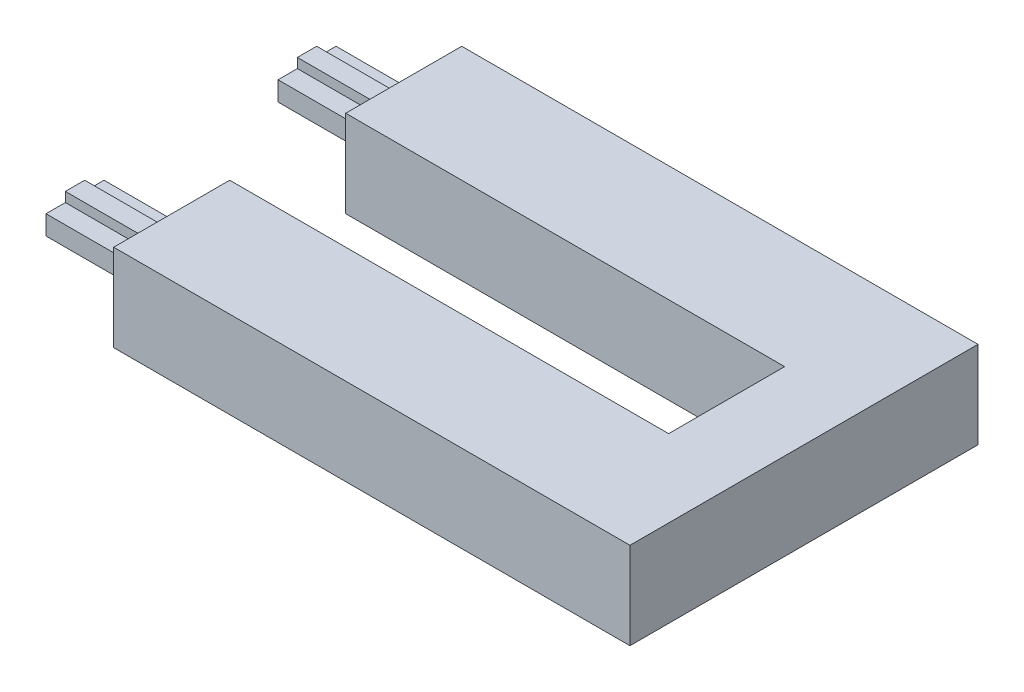
ISO-10303-21;
HEADER;
FILE_DESCRIPTION(('STEP AP214'),'2;1');
FILE_NAME('part.step','',(''),(''),'','','');
FILE_SCHEMA(('AUTOMOTIVE_DESIGN { 1 0 10303 214 1 1 1 1 }'));
ENDSEC;
DATA;
#1=APPLICATION_CONTEXT('core data for automotive mechanical design processes');
#2=APPLICATION_PROTOCOL_DEFINITION('international standard','automotive_design',2000,#1);
#3=PRODUCT_CONTEXT('',#1,'mechanical');
#4=PRODUCT('Part','Part','',(#3));
#5=PRODUCT_RELATED_PRODUCT_CATEGORY('part','',(#4));
#6=PRODUCT_DEFINITION_FORMATION('','',#4);
#7=PRODUCT_DEFINITION_CONTEXT('part definition',#1,'design');
#8=PRODUCT_DEFINITION('design','',#6,#7);
#9=PRODUCT_DEFINITION_SHAPE('','',#8);
#10=(LENGTH_UNIT() NAMED_UNIT(*) SI_UNIT(.MILLI.,.METRE.));
#11=(NAMED_UNIT(*) PLANE_ANGLE_UNIT() SI_UNIT($,.RADIAN.));
#12=(NAMED_UNIT(*) SI_UNIT($,.STERADIAN.) SOLID_ANGLE_UNIT());
#13=UNCERTAINTY_MEASURE_WITH_UNIT(LENGTH_MEASURE(1.E-05),#10,'distance_accuracy_value','');
#14=(GEOMETRIC_REPRESENTATION_CONTEXT(3) GLOBAL_UNCERTAINTY_ASSIGNED_CONTEXT((#13)) GLOBAL_UNIT_ASSIGNED_CONTEXT((#10,
#11,#12)) REPRESENTATION_CONTEXT('',''));
#15=CARTESIAN_POINT('',(0.,0.,0.));
#16=DIRECTION('',(0.,0.,1.));
#17=DIRECTION('',(1.,0.,0.));
#18=AXIS2_PLACEMENT_3D('',#15,#16,#17);
#19=CARTESIAN_POINT('',(0.,4.5,0.));
#20=DIRECTION('',(1.,0.,0.));
#21=DIRECTION('',(0.,0.,-1.));
#22=AXIS2_PLACEMENT_3D('',#19,#20,#21);
#23=PLANE('',#22);
#24=DIRECTION('',(0.,0.,1.));
#25=VECTOR('',#24,1.);
#26=CARTESIAN_POINT('',(0.,1.75,-1.5));
#27=LINE('',#26,#25);
#28=CARTESIAN_POINT('',(0.,1.75,-3.5));
#29=VERTEX_POINT('',#28);
#30=CARTESIAN_POINT('',(0.,1.75,-4.5));
#31=VERTEX_POINT('',#30);
#32=EDGE_CURVE('E354',#29,#31,#27,.F.);
#33=ORIENTED_EDGE('',*,*,#32,.T.);
#34=DIRECTION('',(0.,1.,0.));
#35=VECTOR('',#34,1.);
#36=CARTESIAN_POINT('',(0.,1.75,-4.5));
#37=LINE('',#36,#35);
#38=CARTESIAN_POINT('',(0.,2.75,-4.5));
#39=VERTEX_POINT('',#38);
#40=EDGE_CURVE('E351',#31,#39,#37,.T.);
#41=ORIENTED_EDGE('',*,*,#40,.T.);
#42=DIRECTION('',(0.,0.,1.));
#43=VECTOR('',#42,1.);
#44=CARTESIAN_POINT('',(0.,2.75,-1.5));
#45=LINE('',#44,#43);
#46=CARTESIAN_POINT('',(0.,2.75,-3.5));
#47=VERTEX_POINT('',#46);
#48=EDGE_CURVE('E321',#47,#39,#45,.F.);
#49=ORIENTED_EDGE('',*,*,#48,.F.);
#50=DIRECTION('',(0.,1.,0.));
#51=VECTOR('',#50,1.);
#52=CARTESIAN_POINT('',(0.,1.25,-3.5));
#53=LINE('',#52,#51);
#54=CARTESIAN_POINT('',(0.,3.25,-3.5));
#55=VERTEX_POINT('',#54);
#56=EDGE_CURVE('E404',#47,#55,#53,.T.);
#57=ORIENTED_EDGE('',*,*,#56,.T.);
#58=DIRECTION('',(0.,0.,1.));
#59=VECTOR('',#58,1.);
#60=CARTESIAN_POINT('',(0.,3.25,-3.5));
#61=LINE('',#60,#59);
#62=CARTESIAN_POINT('',(0.,3.25,-2.5));
#63=VERTEX_POINT('',#62);
#64=EDGE_CURVE('E400',#55,#63,#61,.T.);
#65=ORIENTED_EDGE('',*,*,#64,.T.);
#66=DIRECTION('',(0.,1.,0.));
#67=VECTOR('',#66,1.);
#68=CARTESIAN_POINT('',(0.,1.25,-2.5));
#69=LINE('',#68,#67);
#70=CARTESIAN_POINT('',(0.,2.75,-2.5));
#71=VERTEX_POINT('',#70);
#72=EDGE_CURVE('E379',#71,#63,#69,.T.);
#73=ORIENTED_EDGE('',*,*,#72,.F.);
#74=CARTESIAN_POINT('',(0.,2.75,-1.5));
#75=VERTEX_POINT('',#74);
#76=EDGE_CURVE('E347',#75,#71,#45,.F.);
#77=ORIENTED_EDGE('',*,*,#76,.F.);
#78=DIRECTION('',(0.,-1.,0.));
#79=VECTOR('',#78,1.);
#80=CARTESIAN_POINT('',(0.,2.75,-1.5));
#81=LINE('',#80,#79);
#82=CARTESIAN_POINT('',(0.,1.75,-1.5));
#83=VERTEX_POINT('',#82);
#84=EDGE_CURVE('E315',#75,#83,#81,.T.);
#85=ORIENTED_EDGE('',*,*,#84,.T.);
#86=CARTESIAN_POINT('',(0.,1.75,-2.5));
#87=VERTEX_POINT('',#86);
#88=EDGE_CURVE('E106',#83,#87,#27,.F.);
#89=ORIENTED_EDGE('',*,*,#88,.T.);
#90=CARTESIAN_POINT('',(0.,1.25,-2.5));
#91=VERTEX_POINT('',#90);
#92=EDGE_CURVE('E397',#91,#87,#69,.T.);
#93=ORIENTED_EDGE('',*,*,#92,.F.);
#94=DIRECTION('',(0.,0.,-1.));
#95=VECTOR('',#94,1.);
#96=CARTESIAN_POINT('',(0.,1.25,-2.5));
#97=LINE('',#96,#95);
#98=CARTESIAN_POINT('',(0.,1.25,-3.5));
#99=VERTEX_POINT('',#98);
#100=EDGE_CURVE('E409',#91,#99,#97,.T.);
#101=ORIENTED_EDGE('',*,*,#100,.T.);
#102=EDGE_CURVE('E405',#99,#29,#53,.T.);
#103=ORIENTED_EDGE('',*,*,#102,.T.);
#104=EDGE_LOOP('',(#33,#41,#49,#57,#65,#73,#77,#85,#89,#93,#101,#103));
#105=FACE_BOUND('',#104,.T.);
#106=DIRECTION('',(0.,0.,1.));
#107=VECTOR('',#106,1.);
#108=CARTESIAN_POINT('',(0.,0.,0.));
#109=LINE('',#108,#107);
#110=CARTESIAN_POINT('',(0.,0.,-6.));
#111=VERTEX_POINT('',#110);
#112=CARTESIAN_POINT('',(0.,0.,0.));
#113=VERTEX_POINT('',#112);
#114=EDGE_CURVE('E534',#111,#113,#109,.T.);
#115=ORIENTED_EDGE('',*,*,#114,.T.);
#116=DIRECTION('',(0.,-1.,0.));
#117=VECTOR('',#116,1.);
#118=CARTESIAN_POINT('',(0.,4.5,0.));
#119=LINE('',#118,#117);
#120=CARTESIAN_POINT('',(0.,4.5,0.));
#121=VERTEX_POINT('',#120);
#122=EDGE_CURVE('E12',#121,#113,#119,.T.);
#123=ORIENTED_EDGE('',*,*,#122,.F.);
#124=DIRECTION('',(0.,0.,1.));
#125=VECTOR('',#124,1.);
#126=CARTESIAN_POINT('',(0.,4.5,0.));
#127=LINE('',#126,#125);
#128=CARTESIAN_POINT('',(0.,4.5,-6.));
#129=VERTEX_POINT('',#128);
#130=EDGE_CURVE('E535',#129,#121,#127,.T.);
#131=ORIENTED_EDGE('',*,*,#130,.F.);
#132=DIRECTION('',(0.,-1.,0.));
#133=VECTOR('',#132,1.);
#134=CARTESIAN_POINT('',(0.,4.5,-6.));
#135=LINE('',#134,#133);
#136=EDGE_CURVE('E561',#129,#111,#135,.T.);
#137=ORIENTED_EDGE('',*,*,#136,.T.);
#138=EDGE_LOOP('',(#115,#123,#131,#137));
#139=FACE_BOUND('',#138,.T.);
#140=ADVANCED_FACE('F91',(#105,#139),#23,.F.);
#141=CARTESIAN_POINT('',(0.,4.5,0.));
#142=DIRECTION('',(0.,0.,-1.));
#143=DIRECTION('',(-1.,0.,0.));
#144=AXIS2_PLACEMENT_3D('',#141,#142,#143);
#145=PLANE('',#144);
#146=DIRECTION('',(1.,0.,0.));
#147=VECTOR('',#146,1.);
#148=CARTESIAN_POINT('',(0.,0.,0.));
#149=LINE('',#148,#147);
#150=CARTESIAN_POINT('',(26.7,0.,0.));
#151=VERTEX_POINT('',#150);
#152=EDGE_CURVE('E565',#113,#151,#149,.T.);
#153=ORIENTED_EDGE('',*,*,#152,.T.);
#154=DIRECTION('',(0.,-1.,0.));
#155=VECTOR('',#154,1.);
#156=CARTESIAN_POINT('',(26.7,4.5,0.));
#157=LINE('',#156,#155);
#158=CARTESIAN_POINT('',(26.7,4.5,0.));
#159=VERTEX_POINT('',#158);
#160=EDGE_CURVE('E99',#159,#151,#157,.T.);
#161=ORIENTED_EDGE('',*,*,#160,.F.);
#162=DIRECTION('',(1.,0.,0.));
#163=VECTOR('',#162,1.);
#164=CARTESIAN_POINT('',(0.,4.5,0.));
#165=LINE('',#164,#163);
#166=EDGE_CURVE('E539',#121,#159,#165,.T.);
#167=ORIENTED_EDGE('',*,*,#166,.F.);
#168=ORIENTED_EDGE('',*,*,#122,.T.);
#169=EDGE_LOOP('',(#153,#161,#167,#168));
#170=FACE_BOUND('',#169,.T.);
#171=ADVANCED_FACE('F636',(#170),#145,.F.);
#172=CARTESIAN_POINT('',(26.7,4.5,0.));
#173=DIRECTION('',(-1.,0.,0.));
#174=DIRECTION('',(0.,0.,1.));
#175=AXIS2_PLACEMENT_3D('',#172,#173,#174);
#176=PLANE('',#175);
#177=DIRECTION('',(0.,0.,-1.));
#178=VECTOR('',#177,1.);
#179=CARTESIAN_POINT('',(26.7,0.,0.));
#180=LINE('',#179,#178);
#181=CARTESIAN_POINT('',(26.7,0.,-18.));
#182=VERTEX_POINT('',#181);
#183=EDGE_CURVE('E568',#151,#182,#180,.T.);
#184=ORIENTED_EDGE('',*,*,#183,.T.);
#185=DIRECTION('',(0.,-1.,0.));
#186=VECTOR('',#185,1.);
#187=CARTESIAN_POINT('',(26.7,4.5,-18.));
#188=LINE('',#187,#186);
#189=CARTESIAN_POINT('',(26.7,4.5,-18.));
#190=VERTEX_POINT('',#189);
#191=EDGE_CURVE('E604',#190,#182,#188,.T.);
#192=ORIENTED_EDGE('',*,*,#191,.F.);
#193=DIRECTION('',(0.,0.,-1.));
#194=VECTOR('',#193,1.);
#195=CARTESIAN_POINT('',(26.7,4.5,0.));
#196=LINE('',#195,#194);
#197=EDGE_CURVE('E543',#159,#190,#196,.T.);
#198=ORIENTED_EDGE('',*,*,#197,.F.);
#199=ORIENTED_EDGE('',*,*,#160,.T.);
#200=EDGE_LOOP('',(#184,#192,#198,#199));
#201=FACE_BOUND('',#200,.T.);
#202=ADVANCED_FACE('F613',(#201),#176,.F.);
#203=CARTESIAN_POINT('',(0.,4.5,-18.));
#204=DIRECTION('',(0.,0.,1.));
#205=DIRECTION('',(1.,0.,0.));
#206=AXIS2_PLACEMENT_3D('',#203,#204,#205);
#207=PLANE('',#206);
#208=DIRECTION('',(-1.,0.,0.));
#209=VECTOR('',#208,1.);
#210=CARTESIAN_POINT('',(0.,0.,-18.));
#211=LINE('',#210,#209);
#212=CARTESIAN_POINT('',(0.,0.,-18.));
#213=VERTEX_POINT('',#212);
#214=EDGE_CURVE('E571',#182,#213,#211,.T.);
#215=ORIENTED_EDGE('',*,*,#214,.T.);
#216=DIRECTION('',(0.,-1.,0.));
#217=VECTOR('',#216,1.);
#218=CARTESIAN_POINT('',(0.,4.5,-18.));
#219=LINE('',#218,#217);
#220=CARTESIAN_POINT('',(0.,4.5,-18.));
#221=VERTEX_POINT('',#220);
#222=EDGE_CURVE('E600',#221,#213,#219,.T.);
#223=ORIENTED_EDGE('',*,*,#222,.F.);
#224=DIRECTION('',(-1.,0.,0.));
#225=VECTOR('',#224,1.);
#226=CARTESIAN_POINT('',(0.,4.5,-18.));
#227=LINE('',#226,#225);
#228=EDGE_CURVE('E546',#190,#221,#227,.T.);
#229=ORIENTED_EDGE('',*,*,#228,.F.);
#230=ORIENTED_EDGE('',*,*,#191,.T.);
#231=EDGE_LOOP('',(#215,#223,#229,#230));
#232=FACE_BOUND('',#231,.T.);
#233=ADVANCED_FACE('F624',(#232),#207,.F.);
#234=CARTESIAN_POINT('',(0.,4.5,-12.));
#235=DIRECTION('',(1.,0.,0.));
#236=DIRECTION('',(0.,0.,-1.));
#237=AXIS2_PLACEMENT_3D('',#234,#235,#236);
#238=PLANE('',#237);
#239=DIRECTION('',(0.,1.,0.));
#240=VECTOR('',#239,1.);
#241=CARTESIAN_POINT('',(0.,1.25,-15.5));
#242=LINE('',#241,#240);
#243=CARTESIAN_POINT('',(0.,2.75,-15.5));
#244=VERTEX_POINT('',#243);
#245=CARTESIAN_POINT('',(0.,3.25,-15.5));
#246=VERTEX_POINT('',#245);
#247=EDGE_CURVE('E453',#244,#246,#242,.T.);
#248=ORIENTED_EDGE('',*,*,#247,.T.);
#249=DIRECTION('',(0.,0.,1.));
#250=VECTOR('',#249,1.);
#251=CARTESIAN_POINT('',(0.,3.25,-15.5));
#252=LINE('',#251,#250);
#253=CARTESIAN_POINT('',(0.,3.25,-14.5));
#254=VERTEX_POINT('',#253);
#255=EDGE_CURVE('E449',#246,#254,#252,.T.);
#256=ORIENTED_EDGE('',*,*,#255,.T.);
#257=DIRECTION('',(0.,1.,0.));
#258=VECTOR('',#257,1.);
#259=CARTESIAN_POINT('',(0.,1.25,-14.5));
#260=LINE('',#259,#258);
#261=CARTESIAN_POINT('',(0.,2.75,-14.5));
#262=VERTEX_POINT('',#261);
#263=EDGE_CURVE('E425',#262,#254,#260,.T.);
#264=ORIENTED_EDGE('',*,*,#263,.F.);
#265=DIRECTION('',(0.,0.,1.));
#266=VECTOR('',#265,1.);
#267=CARTESIAN_POINT('',(0.,2.75,-16.5));
#268=LINE('',#267,#266);
#269=CARTESIAN_POINT('',(0.,2.75,-13.5));
#270=VERTEX_POINT('',#269);
#271=EDGE_CURVE('E513',#262,#270,#268,.T.);
#272=ORIENTED_EDGE('',*,*,#271,.T.);
#273=DIRECTION('',(0.,-1.,0.));
#274=VECTOR('',#273,1.);
#275=CARTESIAN_POINT('',(0.,2.75,-13.5));
#276=LINE('',#275,#274);
#277=CARTESIAN_POINT('',(0.,1.75,-13.5));
#278=VERTEX_POINT('',#277);
#279=EDGE_CURVE('E509',#270,#278,#276,.T.);
#280=ORIENTED_EDGE('',*,*,#279,.T.);
#281=DIRECTION('',(0.,0.,1.));
#282=VECTOR('',#281,1.);
#283=CARTESIAN_POINT('',(0.,1.75,-16.5));
#284=LINE('',#283,#282);
#285=CARTESIAN_POINT('',(0.,1.75,-14.5));
#286=VERTEX_POINT('',#285);
#287=EDGE_CURVE('E486',#286,#278,#284,.T.);
#288=ORIENTED_EDGE('',*,*,#287,.F.);
#289=CARTESIAN_POINT('',(0.,1.25,-14.5));
#290=VERTEX_POINT('',#289);
#291=EDGE_CURVE('E445',#290,#286,#260,.T.);
#292=ORIENTED_EDGE('',*,*,#291,.F.);
#293=DIRECTION('',(0.,0.,-1.));
#294=VECTOR('',#293,1.);
#295=CARTESIAN_POINT('',(0.,1.25,-14.5));
#296=LINE('',#295,#294);
#297=CARTESIAN_POINT('',(0.,1.25,-15.5));
#298=VERTEX_POINT('',#297);
#299=EDGE_CURVE('E456',#290,#298,#296,.T.);
#300=ORIENTED_EDGE('',*,*,#299,.T.);
#301=CARTESIAN_POINT('',(0.,1.75,-15.5));
#302=VERTEX_POINT('',#301);
#303=EDGE_CURVE('E114',#298,#302,#242,.T.);
#304=ORIENTED_EDGE('',*,*,#303,.T.);
#305=CARTESIAN_POINT('',(0.,1.75,-16.5));
#306=VERTEX_POINT('',#305);
#307=EDGE_CURVE('E506',#306,#302,#284,.T.);
#308=ORIENTED_EDGE('',*,*,#307,.F.);
#309=DIRECTION('',(0.,1.,0.));
#310=VECTOR('',#309,1.);
#311=CARTESIAN_POINT('',(0.,1.75,-16.5));
#312=LINE('',#311,#310);
#313=CARTESIAN_POINT('',(0.,2.75,-16.5));
#314=VERTEX_POINT('',#313);
#315=EDGE_CURVE('E518',#306,#314,#312,.T.);
#316=ORIENTED_EDGE('',*,*,#315,.T.);
#317=EDGE_CURVE('E514',#314,#244,#268,.T.);
#318=ORIENTED_EDGE('',*,*,#317,.T.);
#319=EDGE_LOOP('',(#248,#256,#264,#272,#280,#288,#292,#300,#304,#308,#316,#318));
#320=FACE_BOUND('',#319,.T.);
#321=DIRECTION('',(0.,0.,1.));
#322=VECTOR('',#321,1.);
#323=CARTESIAN_POINT('',(0.,0.,-12.));
#324=LINE('',#323,#322);
#325=CARTESIAN_POINT('',(0.,0.,-12.));
#326=VERTEX_POINT('',#325);
#327=EDGE_CURVE('E574',#213,#326,#324,.T.);
#328=ORIENTED_EDGE('',*,*,#327,.T.);
#329=DIRECTION('',(0.,-1.,0.));
#330=VECTOR('',#329,1.);
#331=CARTESIAN_POINT('',(0.,4.5,-12.));
#332=LINE('',#331,#330);
#333=CARTESIAN_POINT('',(0.,4.5,-12.));
#334=VERTEX_POINT('',#333);
#335=EDGE_CURVE('E596',#334,#326,#332,.T.);
#336=ORIENTED_EDGE('',*,*,#335,.F.);
#337=DIRECTION('',(0.,0.,1.));
#338=VECTOR('',#337,1.);
#339=CARTESIAN_POINT('',(0.,4.5,-12.));
#340=LINE('',#339,#338);
#341=EDGE_CURVE('E549',#221,#334,#340,.T.);
#342=ORIENTED_EDGE('',*,*,#341,.F.);
#343=ORIENTED_EDGE('',*,*,#222,.T.);
#344=EDGE_LOOP('',(#328,#336,#342,#343));
#345=FACE_BOUND('',#344,.T.);
#346=ADVANCED_FACE('F628',(#320,#345),#238,.F.);
#347=CARTESIAN_POINT('',(0.,4.5,-12.));
#348=DIRECTION('',(0.,0.,-1.));
#349=DIRECTION('',(-1.,0.,0.));
#350=AXIS2_PLACEMENT_3D('',#347,#348,#349);
#351=PLANE('',#350);
#352=DIRECTION('',(1.,0.,0.));
#353=VECTOR('',#352,1.);
#354=CARTESIAN_POINT('',(0.,0.,-12.));
#355=LINE('',#354,#353);
#356=CARTESIAN_POINT('',(22.7,0.,-12.));
#357=VERTEX_POINT('',#356);
#358=EDGE_CURVE('E577',#326,#357,#355,.T.);
#359=ORIENTED_EDGE('',*,*,#358,.T.);
#360=DIRECTION('',(0.,-1.,0.));
#361=VECTOR('',#360,1.);
#362=CARTESIAN_POINT('',(22.7,4.5,-12.));
#363=LINE('',#362,#361);
#364=CARTESIAN_POINT('',(22.7,4.5,-12.));
#365=VERTEX_POINT('',#364);
#366=EDGE_CURVE('E592',#365,#357,#363,.T.);
#367=ORIENTED_EDGE('',*,*,#366,.F.);
#368=DIRECTION('',(1.,0.,0.));
#369=VECTOR('',#368,1.);
#370=CARTESIAN_POINT('',(0.,4.5,-12.));
#371=LINE('',#370,#369);
#372=EDGE_CURVE('E552',#334,#365,#371,.T.);
#373=ORIENTED_EDGE('',*,*,#372,.F.);
#374=ORIENTED_EDGE('',*,*,#335,.T.);
#375=EDGE_LOOP('',(#359,#367,#373,#374));
#376=FACE_BOUND('',#375,.T.);
#377=ADVANCED_FACE('F649',(#376),#351,.F.);
#378=CARTESIAN_POINT('',(22.7,4.5,-12.));
#379=DIRECTION('',(1.,0.,0.));
#380=DIRECTION('',(0.,0.,-1.));
#381=AXIS2_PLACEMENT_3D('',#378,#379,#380);
#382=PLANE('',#381);
#383=DIRECTION('',(0.,0.,1.));
#384=VECTOR('',#383,1.);
#385=CARTESIAN_POINT('',(22.7,0.,-12.));
#386=LINE('',#385,#384);
#387=CARTESIAN_POINT('',(22.7,0.,-6.));
#388=VERTEX_POINT('',#387);
#389=EDGE_CURVE('E580',#357,#388,#386,.T.);
#390=ORIENTED_EDGE('',*,*,#389,.T.);
#391=DIRECTION('',(0.,-1.,0.));
#392=VECTOR('',#391,1.);
#393=CARTESIAN_POINT('',(22.7,4.5,-6.));
#394=LINE('',#393,#392);
#395=CARTESIAN_POINT('',(22.7,4.5,-6.));
#396=VERTEX_POINT('',#395);
#397=EDGE_CURVE('E588',#396,#388,#394,.T.);
#398=ORIENTED_EDGE('',*,*,#397,.F.);
#399=DIRECTION('',(0.,0.,1.));
#400=VECTOR('',#399,1.);
#401=CARTESIAN_POINT('',(22.7,4.5,-12.));
#402=LINE('',#401,#400);
#403=EDGE_CURVE('E555',#365,#396,#402,.T.);
#404=ORIENTED_EDGE('',*,*,#403,.F.);
#405=ORIENTED_EDGE('',*,*,#366,.T.);
#406=EDGE_LOOP('',(#390,#398,#404,#405));
#407=FACE_BOUND('',#406,.T.);
#408=ADVANCED_FACE('F647',(#407),#382,.F.);
#409=CARTESIAN_POINT('',(0.,4.5,-6.));
#410=DIRECTION('',(0.,0.,1.));
#411=DIRECTION('',(1.,0.,0.));
#412=AXIS2_PLACEMENT_3D('',#409,#410,#411);
#413=PLANE('',#412);
#414=DIRECTION('',(-1.,0.,0.));
#415=VECTOR('',#414,1.);
#416=CARTESIAN_POINT('',(0.,0.,-6.));
#417=LINE('',#416,#415);
#418=EDGE_CURVE('E540',#388,#111,#417,.T.);
#419=ORIENTED_EDGE('',*,*,#418,.T.);
#420=ORIENTED_EDGE('',*,*,#136,.F.);
#421=DIRECTION('',(-1.,0.,0.));
#422=VECTOR('',#421,1.);
#423=CARTESIAN_POINT('',(0.,4.5,-6.));
#424=LINE('',#423,#422);
#425=EDGE_CURVE('E558',#396,#129,#424,.T.);
#426=ORIENTED_EDGE('',*,*,#425,.F.);
#427=ORIENTED_EDGE('',*,*,#397,.T.);
#428=EDGE_LOOP('',(#419,#420,#426,#427));
#429=FACE_BOUND('',#428,.T.);
#430=ADVANCED_FACE('F642',(#429),#413,.F.);
#431=CARTESIAN_POINT('',(0.,4.5,0.));
#432=DIRECTION('',(0.,-1.,0.));
#433=DIRECTION('',(0.,0.,-1.));
#434=AXIS2_PLACEMENT_3D('',#431,#432,#433);
#435=PLANE('',#434);
#436=ORIENTED_EDGE('',*,*,#130,.T.);
#437=ORIENTED_EDGE('',*,*,#166,.T.);
#438=ORIENTED_EDGE('',*,*,#197,.T.);
#439=ORIENTED_EDGE('',*,*,#228,.T.);
#440=ORIENTED_EDGE('',*,*,#341,.T.);
#441=ORIENTED_EDGE('',*,*,#372,.T.);
#442=ORIENTED_EDGE('',*,*,#403,.T.);
#443=ORIENTED_EDGE('',*,*,#425,.T.);
#444=EDGE_LOOP('',(#436,#437,#438,#439,#440,#441,#442,#443));
#445=FACE_BOUND('',#444,.T.);
#446=ADVANCED_FACE('F632',(#445),#435,.F.);
#447=CARTESIAN_POINT('',(0.,0.,0.));
#448=DIRECTION('',(0.,-1.,0.));
#449=DIRECTION('',(0.,0.,-1.));
#450=AXIS2_PLACEMENT_3D('',#447,#448,#449);
#451=PLANE('',#450);
#452=ORIENTED_EDGE('',*,*,#114,.F.);
#453=ORIENTED_EDGE('',*,*,#418,.F.);
#454=ORIENTED_EDGE('',*,*,#389,.F.);
#455=ORIENTED_EDGE('',*,*,#358,.F.);
#456=ORIENTED_EDGE('',*,*,#327,.F.);
#457=ORIENTED_EDGE('',*,*,#214,.F.);
#458=ORIENTED_EDGE('',*,*,#183,.F.);
#459=ORIENTED_EDGE('',*,*,#152,.F.);
#460=EDGE_LOOP('',(#452,#453,#454,#455,#456,#457,#458,#459));
#461=FACE_BOUND('',#460,.T.);
#462=ADVANCED_FACE('F619',(#461),#451,.T.);
#463=CARTESIAN_POINT('',(-5.,1.75,-16.5));
#464=DIRECTION('',(0.,1.,0.));
#465=DIRECTION('',(0.,0.,1.));
#466=AXIS2_PLACEMENT_3D('',#463,#464,#465);
#467=PLANE('',#466);
#468=DIRECTION('',(-1.,0.,0.));
#469=VECTOR('',#468,1.);
#470=CARTESIAN_POINT('',(-5.,1.75,-14.5));
#471=LINE('',#470,#469);
#472=CARTESIAN_POINT('',(-5.,1.75,-14.5));
#473=VERTEX_POINT('',#472);
#474=EDGE_CURVE('E482',#286,#473,#471,.T.);
#475=ORIENTED_EDGE('',*,*,#474,.F.);
#476=ORIENTED_EDGE('',*,*,#287,.T.);
#477=DIRECTION('',(1.,0.,0.));
#478=VECTOR('',#477,1.);
#479=CARTESIAN_POINT('',(-5.,1.75,-13.5));
#480=LINE('',#479,#478);
#481=CARTESIAN_POINT('',(-5.,1.75,-13.5));
#482=VERTEX_POINT('',#481);
#483=EDGE_CURVE('E530',#482,#278,#480,.T.);
#484=ORIENTED_EDGE('',*,*,#483,.F.);
#485=DIRECTION('',(0.,0.,1.));
#486=VECTOR('',#485,1.);
#487=CARTESIAN_POINT('',(-5.,1.75,-16.5));
#488=LINE('',#487,#486);
#489=EDGE_CURVE('E492',#473,#482,#488,.T.);
#490=ORIENTED_EDGE('',*,*,#489,.F.);
#491=EDGE_LOOP('',(#475,#476,#484,#490));
#492=FACE_BOUND('',#491,.T.);
#493=ADVANCED_FACE('F733',(#492),#467,.F.);
#494=CARTESIAN_POINT('',(-5.,2.75,-16.5));
#495=DIRECTION('',(0.,1.,0.));
#496=DIRECTION('',(0.,0.,1.));
#497=AXIS2_PLACEMENT_3D('',#494,#495,#496);
#498=PLANE('',#497);
#499=ORIENTED_EDGE('',*,*,#271,.F.);
#500=DIRECTION('',(-1.,0.,0.));
#501=VECTOR('',#500,1.);
#502=CARTESIAN_POINT('',(-5.,2.75,-14.5));
#503=LINE('',#502,#501);
#504=CARTESIAN_POINT('',(-5.,2.75,-14.5));
#505=VERTEX_POINT('',#504);
#506=EDGE_CURVE('E478',#262,#505,#503,.T.);
#507=ORIENTED_EDGE('',*,*,#506,.T.);
#508=DIRECTION('',(0.,0.,1.));
#509=VECTOR('',#508,1.);
#510=CARTESIAN_POINT('',(-5.,2.75,-16.5));
#511=LINE('',#510,#509);
#512=CARTESIAN_POINT('',(-5.,2.75,-13.5));
#513=VERTEX_POINT('',#512);
#514=EDGE_CURVE('E496',#505,#513,#511,.T.);
#515=ORIENTED_EDGE('',*,*,#514,.T.);
#516=DIRECTION('',(1.,0.,0.));
#517=VECTOR('',#516,1.);
#518=CARTESIAN_POINT('',(-5.,2.75,-13.5));
#519=LINE('',#518,#517);
#520=EDGE_CURVE('E527',#513,#270,#519,.T.);
#521=ORIENTED_EDGE('',*,*,#520,.T.);
#522=EDGE_LOOP('',(#499,#507,#515,#521));
#523=FACE_BOUND('',#522,.T.);
#524=ADVANCED_FACE('F722',(#523),#498,.T.);
#525=ORIENTED_EDGE('',*,*,#307,.T.);
#526=DIRECTION('',(-1.,0.,0.));
#527=VECTOR('',#526,1.);
#528=CARTESIAN_POINT('',(-5.,1.75,-15.5));
#529=LINE('',#528,#527);
#530=CARTESIAN_POINT('',(-5.,1.75,-15.5));
#531=VERTEX_POINT('',#530);
#532=EDGE_CURVE('E475',#302,#531,#529,.T.);
#533=ORIENTED_EDGE('',*,*,#532,.T.);
#534=CARTESIAN_POINT('',(-5.,1.75,-16.5));
#535=VERTEX_POINT('',#534);
#536=EDGE_CURVE('E487',#535,#531,#488,.T.);
#537=ORIENTED_EDGE('',*,*,#536,.F.);
#538=DIRECTION('',(1.,0.,0.));
#539=VECTOR('',#538,1.);
#540=CARTESIAN_POINT('',(-5.,1.75,-16.5));
#541=LINE('',#540,#539);
#542=EDGE_CURVE('E505',#535,#306,#541,.T.);
#543=ORIENTED_EDGE('',*,*,#542,.T.);
#544=EDGE_LOOP('',(#525,#533,#537,#543));
#545=FACE_BOUND('',#544,.T.);
#546=ADVANCED_FACE('F784',(#545),#467,.F.);
#547=CARTESIAN_POINT('',(-5.,2.75,-13.5));
#548=DIRECTION('',(0.,0.,1.));
#549=DIRECTION('',(1.,0.,0.));
#550=AXIS2_PLACEMENT_3D('',#547,#548,#549);
#551=PLANE('',#550);
#552=ORIENTED_EDGE('',*,*,#279,.F.);
#553=ORIENTED_EDGE('',*,*,#520,.F.);
#554=DIRECTION('',(0.,-1.,0.));
#555=VECTOR('',#554,1.);
#556=CARTESIAN_POINT('',(-5.,2.75,-13.5));
#557=LINE('',#556,#555);
#558=EDGE_CURVE('E491',#513,#482,#557,.T.);
#559=ORIENTED_EDGE('',*,*,#558,.T.);
#560=ORIENTED_EDGE('',*,*,#483,.T.);
#561=EDGE_LOOP('',(#552,#553,#559,#560));
#562=FACE_BOUND('',#561,.T.);
#563=ADVANCED_FACE('F727',(#562),#551,.T.);
#564=DIRECTION('',(-1.,0.,0.));
#565=VECTOR('',#564,1.);
#566=CARTESIAN_POINT('',(-5.,2.75,-15.5));
#567=LINE('',#566,#565);
#568=CARTESIAN_POINT('',(-5.,2.75,-15.5));
#569=VERTEX_POINT('',#568);
#570=EDGE_CURVE('E472',#244,#569,#567,.T.);
#571=ORIENTED_EDGE('',*,*,#570,.F.);
#572=ORIENTED_EDGE('',*,*,#317,.F.);
#573=DIRECTION('',(1.,0.,0.));
#574=VECTOR('',#573,1.);
#575=CARTESIAN_POINT('',(-5.,2.75,-16.5));
#576=LINE('',#575,#574);
#577=CARTESIAN_POINT('',(-5.,2.75,-16.5));
#578=VERTEX_POINT('',#577);
#579=EDGE_CURVE('E524',#578,#314,#576,.T.);
#580=ORIENTED_EDGE('',*,*,#579,.F.);
#581=EDGE_CURVE('E497',#578,#569,#511,.T.);
#582=ORIENTED_EDGE('',*,*,#581,.T.);
#583=EDGE_LOOP('',(#571,#572,#580,#582));
#584=FACE_BOUND('',#583,.T.);
#585=ADVANCED_FACE('F751',(#584),#498,.T.);
#586=CARTESIAN_POINT('',(-5.,1.75,-16.5));
#587=DIRECTION('',(0.,0.,-1.));
#588=DIRECTION('',(-1.,0.,0.));
#589=AXIS2_PLACEMENT_3D('',#586,#587,#588);
#590=PLANE('',#589);
#591=ORIENTED_EDGE('',*,*,#315,.F.);
#592=ORIENTED_EDGE('',*,*,#542,.F.);
#593=DIRECTION('',(0.,1.,0.));
#594=VECTOR('',#593,1.);
#595=CARTESIAN_POINT('',(-5.,1.75,-16.5));
#596=LINE('',#595,#594);
#597=EDGE_CURVE('E501',#535,#578,#596,.T.);
#598=ORIENTED_EDGE('',*,*,#597,.T.);
#599=ORIENTED_EDGE('',*,*,#579,.T.);
#600=EDGE_LOOP('',(#591,#592,#598,#599));
#601=FACE_BOUND('',#600,.T.);
#602=ADVANCED_FACE('F755',(#601),#590,.T.);
#603=CARTESIAN_POINT('',(-5.,0.,0.));
#604=DIRECTION('',(1.,0.,0.));
#605=DIRECTION('',(0.,0.,-1.));
#606=AXIS2_PLACEMENT_3D('',#603,#604,#605);
#607=PLANE('',#606);
#608=ORIENTED_EDGE('',*,*,#536,.T.);
#609=DIRECTION('',(0.,1.,0.));
#610=VECTOR('',#609,1.);
#611=CARTESIAN_POINT('',(-5.,1.25,-15.5));
#612=LINE('',#611,#610);
#613=CARTESIAN_POINT('',(-5.,1.25,-15.5));
#614=VERTEX_POINT('',#613);
#615=EDGE_CURVE('E436',#614,#531,#612,.T.);
#616=ORIENTED_EDGE('',*,*,#615,.F.);
#617=DIRECTION('',(0.,0.,-1.));
#618=VECTOR('',#617,1.);
#619=CARTESIAN_POINT('',(-5.,1.25,-14.5));
#620=LINE('',#619,#618);
#621=CARTESIAN_POINT('',(-5.,1.25,-14.5));
#622=VERTEX_POINT('',#621);
#623=EDGE_CURVE('E440',#622,#614,#620,.T.);
#624=ORIENTED_EDGE('',*,*,#623,.F.);
#625=DIRECTION('',(0.,1.,0.));
#626=VECTOR('',#625,1.);
#627=CARTESIAN_POINT('',(-5.,1.25,-14.5));
#628=LINE('',#627,#626);
#629=EDGE_CURVE('E426',#622,#473,#628,.T.);
#630=ORIENTED_EDGE('',*,*,#629,.T.);
#631=ORIENTED_EDGE('',*,*,#489,.T.);
#632=ORIENTED_EDGE('',*,*,#558,.F.);
#633=ORIENTED_EDGE('',*,*,#514,.F.);
#634=CARTESIAN_POINT('',(-5.,3.25,-14.5));
#635=VERTEX_POINT('',#634);
#636=EDGE_CURVE('E431',#505,#635,#628,.T.);
#637=ORIENTED_EDGE('',*,*,#636,.T.);
#638=DIRECTION('',(0.,0.,1.));
#639=VECTOR('',#638,1.);
#640=CARTESIAN_POINT('',(-5.,3.25,-15.5));
#641=LINE('',#640,#639);
#642=CARTESIAN_POINT('',(-5.,3.25,-15.5));
#643=VERTEX_POINT('',#642);
#644=EDGE_CURVE('E430',#643,#635,#641,.T.);
#645=ORIENTED_EDGE('',*,*,#644,.F.);
#646=EDGE_CURVE('E435',#569,#643,#612,.T.);
#647=ORIENTED_EDGE('',*,*,#646,.F.);
#648=ORIENTED_EDGE('',*,*,#581,.F.);
#649=ORIENTED_EDGE('',*,*,#597,.F.);
#650=EDGE_LOOP('',(#608,#616,#624,#630,#631,#632,#633,#637,#645,#647,#648,#649));
#651=FACE_BOUND('',#650,.T.);
#652=ADVANCED_FACE('F728',(#651),#607,.F.);
#653=CARTESIAN_POINT('',(-5.,3.25,-15.5));
#654=DIRECTION('',(0.,1.,0.));
#655=DIRECTION('',(0.,0.,1.));
#656=AXIS2_PLACEMENT_3D('',#653,#654,#655);
#657=PLANE('',#656);
#658=ORIENTED_EDGE('',*,*,#255,.F.);
#659=DIRECTION('',(1.,0.,0.));
#660=VECTOR('',#659,1.);
#661=CARTESIAN_POINT('',(-5.,3.25,-15.5));
#662=LINE('',#661,#660);
#663=EDGE_CURVE('E465',#643,#246,#662,.T.);
#664=ORIENTED_EDGE('',*,*,#663,.F.);
#665=ORIENTED_EDGE('',*,*,#644,.T.);
#666=DIRECTION('',(1.,0.,0.));
#667=VECTOR('',#666,1.);
#668=CARTESIAN_POINT('',(-5.,3.25,-14.5));
#669=LINE('',#668,#667);
#670=EDGE_CURVE('E468',#635,#254,#669,.T.);
#671=ORIENTED_EDGE('',*,*,#670,.T.);
#672=EDGE_LOOP('',(#658,#664,#665,#671));
#673=FACE_BOUND('',#672,.T.);
#674=ADVANCED_FACE('F742',(#673),#657,.T.);
#675=CARTESIAN_POINT('',(-5.,1.25,-15.5));
#676=DIRECTION('',(0.,0.,-1.));
#677=DIRECTION('',(-1.,0.,0.));
#678=AXIS2_PLACEMENT_3D('',#675,#676,#677);
#679=PLANE('',#678);
#680=ORIENTED_EDGE('',*,*,#247,.F.);
#681=ORIENTED_EDGE('',*,*,#570,.T.);
#682=ORIENTED_EDGE('',*,*,#646,.T.);
#683=ORIENTED_EDGE('',*,*,#663,.T.);
#684=EDGE_LOOP('',(#680,#681,#682,#683));
#685=FACE_BOUND('',#684,.T.);
#686=ADVANCED_FACE('F773',(#685),#679,.T.);
#687=CARTESIAN_POINT('',(-5.,1.25,-14.5));
#688=DIRECTION('',(0.,0.,-1.));
#689=DIRECTION('',(-1.,0.,0.));
#690=AXIS2_PLACEMENT_3D('',#687,#688,#689);
#691=PLANE('',#690);
#692=ORIENTED_EDGE('',*,*,#506,.F.);
#693=ORIENTED_EDGE('',*,*,#263,.T.);
#694=ORIENTED_EDGE('',*,*,#670,.F.);
#695=ORIENTED_EDGE('',*,*,#636,.F.);
#696=EDGE_LOOP('',(#692,#693,#694,#695));
#697=FACE_BOUND('',#696,.T.);
#698=ADVANCED_FACE('F740',(#697),#691,.F.);
#699=ORIENTED_EDGE('',*,*,#291,.T.);
#700=ORIENTED_EDGE('',*,*,#474,.T.);
#701=ORIENTED_EDGE('',*,*,#629,.F.);
#702=DIRECTION('',(1.,0.,0.));
#703=VECTOR('',#702,1.);
#704=CARTESIAN_POINT('',(-5.,1.25,-14.5));
#705=LINE('',#704,#703);
#706=EDGE_CURVE('E444',#622,#290,#705,.T.);
#707=ORIENTED_EDGE('',*,*,#706,.T.);
#708=EDGE_LOOP('',(#699,#700,#701,#707));
#709=FACE_BOUND('',#708,.T.);
#710=ADVANCED_FACE('F765',(#709),#691,.F.);
#711=ORIENTED_EDGE('',*,*,#532,.F.);
#712=ORIENTED_EDGE('',*,*,#303,.F.);
#713=DIRECTION('',(1.,0.,0.));
#714=VECTOR('',#713,1.);
#715=CARTESIAN_POINT('',(-5.,1.25,-15.5));
#716=LINE('',#715,#714);
#717=EDGE_CURVE('E462',#614,#298,#716,.T.);
#718=ORIENTED_EDGE('',*,*,#717,.F.);
#719=ORIENTED_EDGE('',*,*,#615,.T.);
#720=EDGE_LOOP('',(#711,#712,#718,#719));
#721=FACE_BOUND('',#720,.T.);
#722=ADVANCED_FACE('F760',(#721),#679,.T.);
#723=CARTESIAN_POINT('',(-5.,1.25,-14.5));
#724=DIRECTION('',(0.,-1.,0.));
#725=DIRECTION('',(0.,0.,-1.));
#726=AXIS2_PLACEMENT_3D('',#723,#724,#725);
#727=PLANE('',#726);
#728=ORIENTED_EDGE('',*,*,#299,.F.);
#729=ORIENTED_EDGE('',*,*,#706,.F.);
#730=ORIENTED_EDGE('',*,*,#623,.T.);
#731=ORIENTED_EDGE('',*,*,#717,.T.);
#732=EDGE_LOOP('',(#728,#729,#730,#731));
#733=FACE_BOUND('',#732,.T.);
#734=ADVANCED_FACE('F763',(#733),#727,.T.);
#735=CARTESIAN_POINT('',(-5.,1.25,-2.5));
#736=DIRECTION('',(0.,0.,-1.));
#737=DIRECTION('',(-1.,0.,0.));
#738=AXIS2_PLACEMENT_3D('',#735,#736,#737);
#739=PLANE('',#738);
#740=DIRECTION('',(-1.,0.,0.));
#741=VECTOR('',#740,1.);
#742=CARTESIAN_POINT('',(-5.,2.75,-2.5));
#743=LINE('',#742,#741);
#744=CARTESIAN_POINT('',(-5.,2.75,-2.5));
#745=VERTEX_POINT('',#744);
#746=EDGE_CURVE('E375',#71,#745,#743,.T.);
#747=ORIENTED_EDGE('',*,*,#746,.F.);
#748=ORIENTED_EDGE('',*,*,#72,.T.);
#749=DIRECTION('',(1.,0.,0.));
#750=VECTOR('',#749,1.);
#751=CARTESIAN_POINT('',(-5.,3.25,-2.5));
#752=LINE('',#751,#750);
#753=CARTESIAN_POINT('',(-5.,3.25,-2.5));
#754=VERTEX_POINT('',#753);
#755=EDGE_CURVE('E421',#754,#63,#752,.T.);
#756=ORIENTED_EDGE('',*,*,#755,.F.);
#757=DIRECTION('',(0.,1.,0.));
#758=VECTOR('',#757,1.);
#759=CARTESIAN_POINT('',(-5.,1.25,-2.5));
#760=LINE('',#759,#758);
#761=EDGE_CURVE('E384',#745,#754,#760,.T.);
#762=ORIENTED_EDGE('',*,*,#761,.F.);
#763=EDGE_LOOP('',(#747,#748,#756,#762));
#764=FACE_BOUND('',#763,.T.);
#765=ADVANCED_FACE('F696',(#764),#739,.F.);
#766=CARTESIAN_POINT('',(-5.,1.25,-3.5));
#767=DIRECTION('',(0.,0.,-1.));
#768=DIRECTION('',(-1.,0.,0.));
#769=AXIS2_PLACEMENT_3D('',#766,#767,#768);
#770=PLANE('',#769);
#771=ORIENTED_EDGE('',*,*,#56,.F.);
#772=DIRECTION('',(-1.,0.,0.));
#773=VECTOR('',#772,1.);
#774=CARTESIAN_POINT('',(-5.,2.75,-3.5));
#775=LINE('',#774,#773);
#776=CARTESIAN_POINT('',(-5.,2.75,-3.5));
#777=VERTEX_POINT('',#776);
#778=EDGE_CURVE('E372',#47,#777,#775,.T.);
#779=ORIENTED_EDGE('',*,*,#778,.T.);
#780=DIRECTION('',(0.,1.,0.));
#781=VECTOR('',#780,1.);
#782=CARTESIAN_POINT('',(-5.,1.25,-3.5));
#783=LINE('',#782,#781);
#784=CARTESIAN_POINT('',(-5.,3.25,-3.5));
#785=VERTEX_POINT('',#784);
#786=EDGE_CURVE('E310',#777,#785,#783,.T.);
#787=ORIENTED_EDGE('',*,*,#786,.T.);
#788=DIRECTION('',(1.,0.,0.));
#789=VECTOR('',#788,1.);
#790=CARTESIAN_POINT('',(-5.,3.25,-3.5));
#791=LINE('',#790,#789);
#792=EDGE_CURVE('E418',#785,#55,#791,.T.);
#793=ORIENTED_EDGE('',*,*,#792,.T.);
#794=EDGE_LOOP('',(#771,#779,#787,#793));
#795=FACE_BOUND('',#794,.T.);
#796=ADVANCED_FACE('F704',(#795),#770,.T.);
#797=ORIENTED_EDGE('',*,*,#92,.T.);
#798=DIRECTION('',(-1.,0.,0.));
#799=VECTOR('',#798,1.);
#800=CARTESIAN_POINT('',(-5.,1.75,-2.5));
#801=LINE('',#800,#799);
#802=CARTESIAN_POINT('',(-5.,1.75,-2.5));
#803=VERTEX_POINT('',#802);
#804=EDGE_CURVE('E369',#87,#803,#801,.T.);
#805=ORIENTED_EDGE('',*,*,#804,.T.);
#806=CARTESIAN_POINT('',(-5.,1.25,-2.5));
#807=VERTEX_POINT('',#806);
#808=EDGE_CURVE('E380',#807,#803,#760,.T.);
#809=ORIENTED_EDGE('',*,*,#808,.F.);
#810=DIRECTION('',(1.,0.,0.));
#811=VECTOR('',#810,1.);
#812=CARTESIAN_POINT('',(-5.,1.25,-2.5));
#813=LINE('',#812,#811);
#814=EDGE_CURVE('E396',#807,#91,#813,.T.);
#815=ORIENTED_EDGE('',*,*,#814,.T.);
#816=EDGE_LOOP('',(#797,#805,#809,#815));
#817=FACE_BOUND('',#816,.T.);
#818=ADVANCED_FACE('F681',(#817),#739,.F.);
#819=CARTESIAN_POINT('',(-5.,3.25,-3.5));
#820=DIRECTION('',(0.,1.,0.));
#821=DIRECTION('',(0.,0.,1.));
#822=AXIS2_PLACEMENT_3D('',#819,#820,#821);
#823=PLANE('',#822);
#824=ORIENTED_EDGE('',*,*,#64,.F.);
#825=ORIENTED_EDGE('',*,*,#792,.F.);
#826=DIRECTION('',(0.,0.,1.));
#827=VECTOR('',#826,1.);
#828=CARTESIAN_POINT('',(-5.,3.25,-3.5));
#829=LINE('',#828,#827);
#830=EDGE_CURVE('E383',#785,#754,#829,.T.);
#831=ORIENTED_EDGE('',*,*,#830,.T.);
#832=ORIENTED_EDGE('',*,*,#755,.T.);
#833=EDGE_LOOP('',(#824,#825,#831,#832));
#834=FACE_BOUND('',#833,.T.);
#835=ADVANCED_FACE('F700',(#834),#823,.T.);
#836=DIRECTION('',(-1.,0.,0.));
#837=VECTOR('',#836,1.);
#838=CARTESIAN_POINT('',(-5.,1.75,-3.5));
#839=LINE('',#838,#837);
#840=CARTESIAN_POINT('',(-5.,1.75,-3.5));
#841=VERTEX_POINT('',#840);
#842=EDGE_CURVE('E326',#29,#841,#839,.T.);
#843=ORIENTED_EDGE('',*,*,#842,.F.);
#844=ORIENTED_EDGE('',*,*,#102,.F.);
#845=DIRECTION('',(1.,0.,0.));
#846=VECTOR('',#845,1.);
#847=CARTESIAN_POINT('',(-5.,1.25,-3.5));
#848=LINE('',#847,#846);
#849=CARTESIAN_POINT('',(-5.,1.25,-3.5));
#850=VERTEX_POINT('',#849);
#851=EDGE_CURVE('E415',#850,#99,#848,.T.);
#852=ORIENTED_EDGE('',*,*,#851,.F.);
#853=EDGE_CURVE('E388',#850,#841,#783,.T.);
#854=ORIENTED_EDGE('',*,*,#853,.T.);
#855=EDGE_LOOP('',(#843,#844,#852,#854));
#856=FACE_BOUND('',#855,.T.);
#857=ADVANCED_FACE('F672',(#856),#770,.T.);
#858=CARTESIAN_POINT('',(-5.,1.25,-2.5));
#859=DIRECTION('',(0.,-1.,0.));
#860=DIRECTION('',(0.,0.,-1.));
#861=AXIS2_PLACEMENT_3D('',#858,#859,#860);
#862=PLANE('',#861);
#863=ORIENTED_EDGE('',*,*,#100,.F.);
#864=ORIENTED_EDGE('',*,*,#814,.F.);
#865=DIRECTION('',(0.,0.,-1.));
#866=VECTOR('',#865,1.);
#867=CARTESIAN_POINT('',(-5.,1.25,-2.5));
#868=LINE('',#867,#866);
#869=EDGE_CURVE('E392',#807,#850,#868,.T.);
#870=ORIENTED_EDGE('',*,*,#869,.T.);
#871=ORIENTED_EDGE('',*,*,#851,.T.);
#872=EDGE_LOOP('',(#863,#864,#870,#871));
#873=FACE_BOUND('',#872,.T.);
#874=ADVANCED_FACE('F677',(#873),#862,.T.);
#875=CARTESIAN_POINT('',(-5.,0.,0.));
#876=DIRECTION('',(1.,0.,0.));
#877=DIRECTION('',(0.,0.,-1.));
#878=AXIS2_PLACEMENT_3D('',#875,#876,#877);
#879=PLANE('',#878);
#880=ORIENTED_EDGE('',*,*,#808,.T.);
#881=DIRECTION('',(0.,0.,1.));
#882=VECTOR('',#881,1.);
#883=CARTESIAN_POINT('',(-5.,1.75,-1.5));
#884=LINE('',#883,#882);
#885=CARTESIAN_POINT('',(-5.,1.75,-1.5));
#886=VERTEX_POINT('',#885);
#887=EDGE_CURVE('E336',#886,#803,#884,.F.);
#888=ORIENTED_EDGE('',*,*,#887,.F.);
#889=DIRECTION('',(0.,-1.,0.));
#890=VECTOR('',#889,1.);
#891=CARTESIAN_POINT('',(-5.,2.75,-1.5));
#892=LINE('',#891,#890);
#893=CARTESIAN_POINT('',(-5.,2.75,-1.5));
#894=VERTEX_POINT('',#893);
#895=EDGE_CURVE('E342',#894,#886,#892,.T.);
#896=ORIENTED_EDGE('',*,*,#895,.F.);
#897=DIRECTION('',(0.,0.,1.));
#898=VECTOR('',#897,1.);
#899=CARTESIAN_POINT('',(-5.,2.75,-1.5));
#900=LINE('',#899,#898);
#901=EDGE_CURVE('E314',#894,#745,#900,.F.);
#902=ORIENTED_EDGE('',*,*,#901,.T.);
#903=ORIENTED_EDGE('',*,*,#761,.T.);
#904=ORIENTED_EDGE('',*,*,#830,.F.);
#905=ORIENTED_EDGE('',*,*,#786,.F.);
#906=CARTESIAN_POINT('',(-5.,2.75,-4.5));
#907=VERTEX_POINT('',#906);
#908=EDGE_CURVE('E302',#777,#907,#900,.F.);
#909=ORIENTED_EDGE('',*,*,#908,.T.);
#910=DIRECTION('',(0.,1.,0.));
#911=VECTOR('',#910,1.);
#912=CARTESIAN_POINT('',(-5.,1.75,-4.5));
#913=LINE('',#912,#911);
#914=CARTESIAN_POINT('',(-5.,1.75,-4.5));
#915=VERTEX_POINT('',#914);
#916=EDGE_CURVE('E308',#915,#907,#913,.T.);
#917=ORIENTED_EDGE('',*,*,#916,.F.);
#918=EDGE_CURVE('E332',#841,#915,#884,.F.);
#919=ORIENTED_EDGE('',*,*,#918,.F.);
#920=ORIENTED_EDGE('',*,*,#853,.F.);
#921=ORIENTED_EDGE('',*,*,#869,.F.);
#922=EDGE_LOOP('',(#880,#888,#896,#902,#903,#904,#905,#909,#917,#919,#920,#921));
#923=FACE_BOUND('',#922,.T.);
#924=ADVANCED_FACE('F305',(#923),#879,.F.);
#925=CARTESIAN_POINT('',(-5.,1.75,-4.5));
#926=DIRECTION('',(0.,0.,-1.));
#927=DIRECTION('',(-1.,0.,0.));
#928=AXIS2_PLACEMENT_3D('',#925,#926,#927);
#929=PLANE('',#928);
#930=ORIENTED_EDGE('',*,*,#40,.F.);
#931=DIRECTION('',(1.,0.,0.));
#932=VECTOR('',#931,1.);
#933=CARTESIAN_POINT('',(-5.,1.75,-4.5));
#934=LINE('',#933,#932);
#935=EDGE_CURVE('E327',#915,#31,#934,.T.);
#936=ORIENTED_EDGE('',*,*,#935,.F.);
#937=ORIENTED_EDGE('',*,*,#916,.T.);
#938=DIRECTION('',(1.,0.,0.));
#939=VECTOR('',#938,1.);
#940=CARTESIAN_POINT('',(-5.,2.75,-4.5));
#941=LINE('',#940,#939);
#942=EDGE_CURVE('E318',#907,#39,#941,.T.);
#943=ORIENTED_EDGE('',*,*,#942,.T.);
#944=EDGE_LOOP('',(#930,#936,#937,#943));
#945=FACE_BOUND('',#944,.T.);
#946=ADVANCED_FACE('F330',(#945),#929,.T.);
#947=CARTESIAN_POINT('',(-5.,1.75,-1.5));
#948=DIRECTION('',(0.,-1.,0.));
#949=DIRECTION('',(0.,0.,-1.));
#950=AXIS2_PLACEMENT_3D('',#947,#948,#949);
#951=PLANE('',#950);
#952=ORIENTED_EDGE('',*,*,#32,.F.);
#953=ORIENTED_EDGE('',*,*,#842,.T.);
#954=ORIENTED_EDGE('',*,*,#918,.T.);
#955=ORIENTED_EDGE('',*,*,#935,.T.);
#956=EDGE_LOOP('',(#952,#953,#954,#955));
#957=FACE_BOUND('',#956,.T.);
#958=ADVANCED_FACE('F670',(#957),#951,.T.);
#959=CARTESIAN_POINT('',(-5.,2.75,-1.5));
#960=DIRECTION('',(0.,-1.,0.));
#961=DIRECTION('',(0.,0.,-1.));
#962=AXIS2_PLACEMENT_3D('',#959,#960,#961);
#963=PLANE('',#962);
#964=ORIENTED_EDGE('',*,*,#778,.F.);
#965=ORIENTED_EDGE('',*,*,#48,.T.);
#966=ORIENTED_EDGE('',*,*,#942,.F.);
#967=ORIENTED_EDGE('',*,*,#908,.F.);
#968=EDGE_LOOP('',(#964,#965,#966,#967));
#969=FACE_BOUND('',#968,.T.);
#970=ADVANCED_FACE('F319',(#969),#963,.F.);
#971=ORIENTED_EDGE('',*,*,#76,.T.);
#972=ORIENTED_EDGE('',*,*,#746,.T.);
#973=ORIENTED_EDGE('',*,*,#901,.F.);
#974=DIRECTION('',(1.,0.,0.));
#975=VECTOR('',#974,1.);
#976=CARTESIAN_POINT('',(-5.,2.75,-1.5));
#977=LINE('',#976,#975);
#978=EDGE_CURVE('E346',#894,#75,#977,.T.);
#979=ORIENTED_EDGE('',*,*,#978,.T.);
#980=EDGE_LOOP('',(#971,#972,#973,#979));
#981=FACE_BOUND('',#980,.T.);
#982=ADVANCED_FACE('F691',(#981),#963,.F.);
#983=ORIENTED_EDGE('',*,*,#804,.F.);
#984=ORIENTED_EDGE('',*,*,#88,.F.);
#985=DIRECTION('',(1.,0.,0.));
#986=VECTOR('',#985,1.);
#987=CARTESIAN_POINT('',(-5.,1.75,-1.5));
#988=LINE('',#987,#986);
#989=EDGE_CURVE('E362',#886,#83,#988,.T.);
#990=ORIENTED_EDGE('',*,*,#989,.F.);
#991=ORIENTED_EDGE('',*,*,#887,.T.);
#992=EDGE_LOOP('',(#983,#984,#990,#991));
#993=FACE_BOUND('',#992,.T.);
#994=ADVANCED_FACE('F684',(#993),#951,.T.);
#995=CARTESIAN_POINT('',(-5.,2.75,-1.5));
#996=DIRECTION('',(0.,0.,1.));
#997=DIRECTION('',(1.,0.,0.));
#998=AXIS2_PLACEMENT_3D('',#995,#996,#997);
#999=PLANE('',#998);
#1000=ORIENTED_EDGE('',*,*,#84,.F.);
#1001=ORIENTED_EDGE('',*,*,#978,.F.);
#1002=ORIENTED_EDGE('',*,*,#895,.T.);
#1003=ORIENTED_EDGE('',*,*,#989,.T.);
#1004=EDGE_LOOP('',(#1000,#1001,#1002,#1003));
#1005=FACE_BOUND('',#1004,.T.);
#1006=ADVANCED_FACE('F687',(#1005),#999,.T.);
#1007=CLOSED_SHELL('',(#140,#171,#202,#233,#346,#377,#408,#430,#446,#462,#493,#524,#546,#563,
#585,#602,#652,#674,#686,#698,#710,#722,#734,#765,#796,#818,#835,#857,#874,#924,#946,#958,#970,
#982,#994,#1006));
#1008=MANIFOLD_SOLID_BREP('B2',#1007);
#1009=ADVANCED_BREP_SHAPE_REPRESENTATION('',(#18,#1008),#14);
#1010=SHAPE_DEFINITION_REPRESENTATION(#9,#1009);
ENDSEC;
END-ISO-10303-21;
